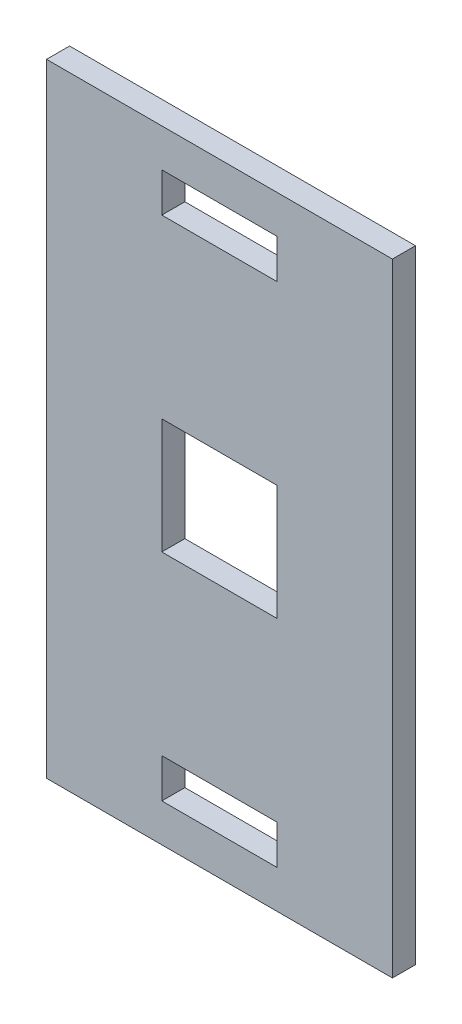
ISO-10303-21;
HEADER;
FILE_DESCRIPTION(('STEP AP214'),'2;1');
FILE_NAME('part.step','',(''),(''),'','','');
FILE_SCHEMA(('AUTOMOTIVE_DESIGN { 1 0 10303 214 1 1 1 1 }'));
ENDSEC;
DATA;
#1=APPLICATION_CONTEXT('core data for automotive mechanical design processes');
#2=APPLICATION_PROTOCOL_DEFINITION('international standard','automotive_design',2000,#1);
#3=PRODUCT_CONTEXT('',#1,'mechanical');
#4=PRODUCT('Part','Part','',(#3));
#5=PRODUCT_RELATED_PRODUCT_CATEGORY('part','',(#4));
#6=PRODUCT_DEFINITION_FORMATION('','',#4);
#7=PRODUCT_DEFINITION_CONTEXT('part definition',#1,'design');
#8=PRODUCT_DEFINITION('design','',#6,#7);
#9=PRODUCT_DEFINITION_SHAPE('','',#8);
#10=(LENGTH_UNIT() NAMED_UNIT(*) SI_UNIT(.MILLI.,.METRE.));
#11=(NAMED_UNIT(*) PLANE_ANGLE_UNIT() SI_UNIT($,.RADIAN.));
#12=(NAMED_UNIT(*) SI_UNIT($,.STERADIAN.) SOLID_ANGLE_UNIT());
#13=UNCERTAINTY_MEASURE_WITH_UNIT(LENGTH_MEASURE(1.E-05),#10,'distance_accuracy_value','');
#14=(GEOMETRIC_REPRESENTATION_CONTEXT(3) GLOBAL_UNCERTAINTY_ASSIGNED_CONTEXT((#13)) GLOBAL_UNIT_ASSIGNED_CONTEXT((#10,
#11,#12)) REPRESENTATION_CONTEXT('',''));
#15=CARTESIAN_POINT('',(0.,0.,0.));
#16=DIRECTION('',(0.,0.,1.));
#17=DIRECTION('',(1.,0.,0.));
#18=AXIS2_PLACEMENT_3D('',#15,#16,#17);
#19=CARTESIAN_POINT('',(0.,0.,2.));
#20=DIRECTION('',(0.,0.,-1.));
#21=DIRECTION('',(-1.,0.,0.));
#22=AXIS2_PLACEMENT_3D('',#19,#20,#21);
#23=PLANE('',#22);
#24=DIRECTION('',(0.,-1.,0.));
#25=VECTOR('',#24,1.);
#26=CARTESIAN_POINT('',(-5.,0.,2.));
#27=LINE('',#26,#25);
#28=CARTESIAN_POINT('',(-5.,-20.3,2.));
#29=VERTEX_POINT('',#28);
#30=CARTESIAN_POINT('',(-5.,-23.7,2.));
#31=VERTEX_POINT('',#30);
#32=EDGE_CURVE('E188',#29,#31,#27,.T.);
#33=ORIENTED_EDGE('',*,*,#32,.F.);
#34=DIRECTION('',(-1.,0.,0.));
#35=VECTOR('',#34,1.);
#36=CARTESIAN_POINT('',(0.,-20.3,2.));
#37=LINE('',#36,#35);
#38=CARTESIAN_POINT('',(5.,-20.3,2.));
#39=VERTEX_POINT('',#38);
#40=EDGE_CURVE('E181',#39,#29,#37,.T.);
#41=ORIENTED_EDGE('',*,*,#40,.F.);
#42=DIRECTION('',(0.,1.,0.));
#43=VECTOR('',#42,1.);
#44=CARTESIAN_POINT('',(5.,0.,2.));
#45=LINE('',#44,#43);
#46=CARTESIAN_POINT('',(5.,-23.7,2.));
#47=VERTEX_POINT('',#46);
#48=EDGE_CURVE('E183',#47,#39,#45,.T.);
#49=ORIENTED_EDGE('',*,*,#48,.F.);
#50=DIRECTION('',(1.,0.,0.));
#51=VECTOR('',#50,1.);
#52=CARTESIAN_POINT('',(0.,-23.7,2.));
#53=LINE('',#52,#51);
#54=EDGE_CURVE('E186',#31,#47,#53,.T.);
#55=ORIENTED_EDGE('',*,*,#54,.F.);
#56=EDGE_LOOP('',(#33,#41,#49,#55));
#57=FACE_BOUND('',#56,.T.);
#58=DIRECTION('',(0.,-1.,0.));
#59=VECTOR('',#58,1.);
#60=CARTESIAN_POINT('',(-15.,-27.,2.));
#61=LINE('',#60,#59);
#62=CARTESIAN_POINT('',(-15.,27.,2.));
#63=VERTEX_POINT('',#62);
#64=CARTESIAN_POINT('',(-15.,-27.,2.));
#65=VERTEX_POINT('',#64);
#66=EDGE_CURVE('E211',#63,#65,#61,.T.);
#67=ORIENTED_EDGE('',*,*,#66,.T.);
#68=DIRECTION('',(1.,0.,0.));
#69=VECTOR('',#68,1.);
#70=CARTESIAN_POINT('',(-15.,-27.,2.));
#71=LINE('',#70,#69);
#72=CARTESIAN_POINT('',(15.,-27.,2.));
#73=VERTEX_POINT('',#72);
#74=EDGE_CURVE('E214',#65,#73,#71,.T.);
#75=ORIENTED_EDGE('',*,*,#74,.T.);
#76=DIRECTION('',(0.,1.,0.));
#77=VECTOR('',#76,1.);
#78=CARTESIAN_POINT('',(15.,-27.,2.));
#79=LINE('',#78,#77);
#80=CARTESIAN_POINT('',(15.,27.,2.));
#81=VERTEX_POINT('',#80);
#82=EDGE_CURVE('E217',#73,#81,#79,.T.);
#83=ORIENTED_EDGE('',*,*,#82,.T.);
#84=DIRECTION('',(-1.,0.,0.));
#85=VECTOR('',#84,1.);
#86=CARTESIAN_POINT('',(-15.,27.,2.));
#87=LINE('',#86,#85);
#88=EDGE_CURVE('E219',#81,#63,#87,.T.);
#89=ORIENTED_EDGE('',*,*,#88,.T.);
#90=EDGE_LOOP('',(#67,#75,#83,#89));
#91=FACE_BOUND('',#90,.T.);
#92=DIRECTION('',(0.,-1.,0.));
#93=VECTOR('',#92,1.);
#94=CARTESIAN_POINT('',(-5.,0.,2.));
#95=LINE('',#94,#93);
#96=CARTESIAN_POINT('',(-5.,5.,2.));
#97=VERTEX_POINT('',#96);
#98=CARTESIAN_POINT('',(-5.,-5.,2.));
#99=VERTEX_POINT('',#98);
#100=EDGE_CURVE('E208',#97,#99,#95,.T.);
#101=ORIENTED_EDGE('',*,*,#100,.F.);
#102=DIRECTION('',(-1.,0.,0.));
#103=VECTOR('',#102,1.);
#104=CARTESIAN_POINT('',(0.,5.,2.));
#105=LINE('',#104,#103);
#106=CARTESIAN_POINT('',(5.,5.,2.));
#107=VERTEX_POINT('',#106);
#108=EDGE_CURVE('E201',#107,#97,#105,.T.);
#109=ORIENTED_EDGE('',*,*,#108,.F.);
#110=DIRECTION('',(0.,1.,0.));
#111=VECTOR('',#110,1.);
#112=CARTESIAN_POINT('',(5.,0.,2.));
#113=LINE('',#112,#111);
#114=CARTESIAN_POINT('',(5.,-5.,2.));
#115=VERTEX_POINT('',#114);
#116=EDGE_CURVE('E203',#115,#107,#113,.T.);
#117=ORIENTED_EDGE('',*,*,#116,.F.);
#118=DIRECTION('',(1.,0.,0.));
#119=VECTOR('',#118,1.);
#120=CARTESIAN_POINT('',(0.,-5.,2.));
#121=LINE('',#120,#119);
#122=EDGE_CURVE('E206',#99,#115,#121,.T.);
#123=ORIENTED_EDGE('',*,*,#122,.F.);
#124=EDGE_LOOP('',(#101,#109,#117,#123));
#125=FACE_BOUND('',#124,.T.);
#126=DIRECTION('',(0.,-1.,0.));
#127=VECTOR('',#126,1.);
#128=CARTESIAN_POINT('',(-5.,0.,2.));
#129=LINE('',#128,#127);
#130=CARTESIAN_POINT('',(-5.,23.7,2.));
#131=VERTEX_POINT('',#130);
#132=CARTESIAN_POINT('',(-5.,20.3,2.));
#133=VERTEX_POINT('',#132);
#134=EDGE_CURVE('E160',#131,#133,#129,.T.);
#135=ORIENTED_EDGE('',*,*,#134,.F.);
#136=DIRECTION('',(-1.,0.,0.));
#137=VECTOR('',#136,1.);
#138=CARTESIAN_POINT('',(0.,23.7,2.));
#139=LINE('',#138,#137);
#140=CARTESIAN_POINT('',(5.,23.7,2.));
#141=VERTEX_POINT('',#140);
#142=EDGE_CURVE('E149',#141,#131,#139,.T.);
#143=ORIENTED_EDGE('',*,*,#142,.F.);
#144=DIRECTION('',(0.,1.,0.));
#145=VECTOR('',#144,1.);
#146=CARTESIAN_POINT('',(5.,0.,2.));
#147=LINE('',#146,#145);
#148=CARTESIAN_POINT('',(5.,20.3,2.));
#149=VERTEX_POINT('',#148);
#150=EDGE_CURVE('E154',#149,#141,#147,.T.);
#151=ORIENTED_EDGE('',*,*,#150,.F.);
#152=DIRECTION('',(1.,0.,0.));
#153=VECTOR('',#152,1.);
#154=CARTESIAN_POINT('',(0.,20.3,2.));
#155=LINE('',#154,#153);
#156=EDGE_CURVE('E165',#133,#149,#155,.T.);
#157=ORIENTED_EDGE('',*,*,#156,.F.);
#158=EDGE_LOOP('',(#135,#143,#151,#157));
#159=FACE_BOUND('',#158,.T.);
#160=ADVANCED_FACE('F39',(#57,#91,#125,#159),#23,.F.);
#161=CARTESIAN_POINT('',(0.,0.,0.));
#162=DIRECTION('',(0.,0.,-1.));
#163=DIRECTION('',(-1.,0.,0.));
#164=AXIS2_PLACEMENT_3D('',#161,#162,#163);
#165=PLANE('',#164);
#166=DIRECTION('',(0.,-1.,0.));
#167=VECTOR('',#166,1.);
#168=CARTESIAN_POINT('',(-15.,-27.,0.));
#169=LINE('',#168,#167);
#170=CARTESIAN_POINT('',(-15.,27.,0.));
#171=VERTEX_POINT('',#170);
#172=CARTESIAN_POINT('',(-15.,-27.,0.));
#173=VERTEX_POINT('',#172);
#174=EDGE_CURVE('E210',#171,#173,#169,.T.);
#175=ORIENTED_EDGE('',*,*,#174,.F.);
#176=DIRECTION('',(-1.,0.,0.));
#177=VECTOR('',#176,1.);
#178=CARTESIAN_POINT('',(-15.,27.,0.));
#179=LINE('',#178,#177);
#180=CARTESIAN_POINT('',(15.,27.,0.));
#181=VERTEX_POINT('',#180);
#182=EDGE_CURVE('E215',#181,#171,#179,.T.);
#183=ORIENTED_EDGE('',*,*,#182,.F.);
#184=DIRECTION('',(0.,1.,0.));
#185=VECTOR('',#184,1.);
#186=CARTESIAN_POINT('',(15.,-27.,0.));
#187=LINE('',#186,#185);
#188=CARTESIAN_POINT('',(15.,-27.,0.));
#189=VERTEX_POINT('',#188);
#190=EDGE_CURVE('E226',#189,#181,#187,.T.);
#191=ORIENTED_EDGE('',*,*,#190,.F.);
#192=DIRECTION('',(1.,0.,0.));
#193=VECTOR('',#192,1.);
#194=CARTESIAN_POINT('',(-15.,-27.,0.));
#195=LINE('',#194,#193);
#196=EDGE_CURVE('E224',#173,#189,#195,.T.);
#197=ORIENTED_EDGE('',*,*,#196,.F.);
#198=EDGE_LOOP('',(#175,#183,#191,#197));
#199=FACE_BOUND('',#198,.T.);
#200=DIRECTION('',(-1.,0.,0.));
#201=VECTOR('',#200,1.);
#202=CARTESIAN_POINT('',(0.,5.,0.));
#203=LINE('',#202,#201);
#204=CARTESIAN_POINT('',(5.,5.,0.));
#205=VERTEX_POINT('',#204);
#206=CARTESIAN_POINT('',(-5.,5.,0.));
#207=VERTEX_POINT('',#206);
#208=EDGE_CURVE('E240',#205,#207,#203,.T.);
#209=ORIENTED_EDGE('',*,*,#208,.T.);
#210=DIRECTION('',(0.,-1.,0.));
#211=VECTOR('',#210,1.);
#212=CARTESIAN_POINT('',(-5.,0.,0.));
#213=LINE('',#212,#211);
#214=CARTESIAN_POINT('',(-5.,-5.,0.));
#215=VERTEX_POINT('',#214);
#216=EDGE_CURVE('E249',#207,#215,#213,.T.);
#217=ORIENTED_EDGE('',*,*,#216,.T.);
#218=DIRECTION('',(1.,0.,0.));
#219=VECTOR('',#218,1.);
#220=CARTESIAN_POINT('',(0.,-5.,0.));
#221=LINE('',#220,#219);
#222=CARTESIAN_POINT('',(5.,-5.,0.));
#223=VERTEX_POINT('',#222);
#224=EDGE_CURVE('E246',#215,#223,#221,.T.);
#225=ORIENTED_EDGE('',*,*,#224,.T.);
#226=DIRECTION('',(0.,1.,0.));
#227=VECTOR('',#226,1.);
#228=CARTESIAN_POINT('',(5.,0.,0.));
#229=LINE('',#228,#227);
#230=EDGE_CURVE('E243',#223,#205,#229,.T.);
#231=ORIENTED_EDGE('',*,*,#230,.T.);
#232=EDGE_LOOP('',(#209,#217,#225,#231));
#233=FACE_BOUND('',#232,.T.);
#234=DIRECTION('',(-1.,0.,0.));
#235=VECTOR('',#234,1.);
#236=CARTESIAN_POINT('',(0.,-20.3,0.));
#237=LINE('',#236,#235);
#238=CARTESIAN_POINT('',(5.,-20.3,0.));
#239=VERTEX_POINT('',#238);
#240=CARTESIAN_POINT('',(-5.,-20.3,0.));
#241=VERTEX_POINT('',#240);
#242=EDGE_CURVE('E252',#239,#241,#237,.T.);
#243=ORIENTED_EDGE('',*,*,#242,.T.);
#244=DIRECTION('',(0.,-1.,0.));
#245=VECTOR('',#244,1.);
#246=CARTESIAN_POINT('',(-5.,0.,0.));
#247=LINE('',#246,#245);
#248=CARTESIAN_POINT('',(-5.,-23.7,0.));
#249=VERTEX_POINT('',#248);
#250=EDGE_CURVE('E261',#241,#249,#247,.T.);
#251=ORIENTED_EDGE('',*,*,#250,.T.);
#252=DIRECTION('',(1.,0.,0.));
#253=VECTOR('',#252,1.);
#254=CARTESIAN_POINT('',(0.,-23.7,0.));
#255=LINE('',#254,#253);
#256=CARTESIAN_POINT('',(5.,-23.7,0.));
#257=VERTEX_POINT('',#256);
#258=EDGE_CURVE('E258',#249,#257,#255,.T.);
#259=ORIENTED_EDGE('',*,*,#258,.T.);
#260=DIRECTION('',(0.,1.,0.));
#261=VECTOR('',#260,1.);
#262=CARTESIAN_POINT('',(5.,0.,0.));
#263=LINE('',#262,#261);
#264=EDGE_CURVE('E255',#257,#239,#263,.T.);
#265=ORIENTED_EDGE('',*,*,#264,.T.);
#266=EDGE_LOOP('',(#243,#251,#259,#265));
#267=FACE_BOUND('',#266,.T.);
#268=DIRECTION('',(-1.,0.,0.));
#269=VECTOR('',#268,1.);
#270=CARTESIAN_POINT('',(0.,23.7,0.));
#271=LINE('',#270,#269);
#272=CARTESIAN_POINT('',(5.,23.7,0.));
#273=VERTEX_POINT('',#272);
#274=CARTESIAN_POINT('',(-5.,23.7,0.));
#275=VERTEX_POINT('',#274);
#276=EDGE_CURVE('E264',#273,#275,#271,.T.);
#277=ORIENTED_EDGE('',*,*,#276,.T.);
#278=DIRECTION('',(0.,-1.,0.));
#279=VECTOR('',#278,1.);
#280=CARTESIAN_POINT('',(-5.,0.,0.));
#281=LINE('',#280,#279);
#282=CARTESIAN_POINT('',(-5.,20.3,0.));
#283=VERTEX_POINT('',#282);
#284=EDGE_CURVE('E11',#275,#283,#281,.T.);
#285=ORIENTED_EDGE('',*,*,#284,.T.);
#286=DIRECTION('',(1.,0.,0.));
#287=VECTOR('',#286,1.);
#288=CARTESIAN_POINT('',(0.,20.3,0.));
#289=LINE('',#288,#287);
#290=CARTESIAN_POINT('',(5.,20.3,0.));
#291=VERTEX_POINT('',#290);
#292=EDGE_CURVE('E47',#283,#291,#289,.T.);
#293=ORIENTED_EDGE('',*,*,#292,.T.);
#294=DIRECTION('',(0.,1.,0.));
#295=VECTOR('',#294,1.);
#296=CARTESIAN_POINT('',(5.,0.,0.));
#297=LINE('',#296,#295);
#298=EDGE_CURVE('E266',#291,#273,#297,.T.);
#299=ORIENTED_EDGE('',*,*,#298,.T.);
#300=EDGE_LOOP('',(#277,#285,#293,#299));
#301=FACE_BOUND('',#300,.T.);
#302=ADVANCED_FACE('F270',(#199,#233,#267,#301),#165,.T.);
#303=CARTESIAN_POINT('',(-15.,-27.,2.));
#304=DIRECTION('',(1.,0.,0.));
#305=DIRECTION('',(0.,0.,-1.));
#306=AXIS2_PLACEMENT_3D('',#303,#304,#305);
#307=PLANE('',#306);
#308=ORIENTED_EDGE('',*,*,#174,.T.);
#309=DIRECTION('',(0.,0.,-1.));
#310=VECTOR('',#309,1.);
#311=CARTESIAN_POINT('',(-15.,-27.,2.));
#312=LINE('',#311,#310);
#313=EDGE_CURVE('E237',#65,#173,#312,.T.);
#314=ORIENTED_EDGE('',*,*,#313,.F.);
#315=ORIENTED_EDGE('',*,*,#66,.F.);
#316=DIRECTION('',(0.,0.,-1.));
#317=VECTOR('',#316,1.);
#318=CARTESIAN_POINT('',(-15.,27.,2.));
#319=LINE('',#318,#317);
#320=EDGE_CURVE('E221',#63,#171,#319,.T.);
#321=ORIENTED_EDGE('',*,*,#320,.T.);
#322=EDGE_LOOP('',(#308,#314,#315,#321));
#323=FACE_BOUND('',#322,.T.);
#324=ADVANCED_FACE('F41',(#323),#307,.F.);
#325=CARTESIAN_POINT('',(-15.,-27.,2.));
#326=DIRECTION('',(0.,1.,0.));
#327=DIRECTION('',(0.,0.,1.));
#328=AXIS2_PLACEMENT_3D('',#325,#326,#327);
#329=PLANE('',#328);
#330=ORIENTED_EDGE('',*,*,#196,.T.);
#331=DIRECTION('',(0.,0.,-1.));
#332=VECTOR('',#331,1.);
#333=CARTESIAN_POINT('',(15.,-27.,2.));
#334=LINE('',#333,#332);
#335=EDGE_CURVE('E234',#73,#189,#334,.T.);
#336=ORIENTED_EDGE('',*,*,#335,.F.);
#337=ORIENTED_EDGE('',*,*,#74,.F.);
#338=ORIENTED_EDGE('',*,*,#313,.T.);
#339=EDGE_LOOP('',(#330,#336,#337,#338));
#340=FACE_BOUND('',#339,.T.);
#341=ADVANCED_FACE('F310',(#340),#329,.F.);
#342=CARTESIAN_POINT('',(15.,-27.,2.));
#343=DIRECTION('',(-1.,0.,0.));
#344=DIRECTION('',(0.,0.,1.));
#345=AXIS2_PLACEMENT_3D('',#342,#343,#344);
#346=PLANE('',#345);
#347=ORIENTED_EDGE('',*,*,#190,.T.);
#348=DIRECTION('',(0.,0.,-1.));
#349=VECTOR('',#348,1.);
#350=CARTESIAN_POINT('',(15.,27.,2.));
#351=LINE('',#350,#349);
#352=EDGE_CURVE('E231',#81,#181,#351,.T.);
#353=ORIENTED_EDGE('',*,*,#352,.F.);
#354=ORIENTED_EDGE('',*,*,#82,.F.);
#355=ORIENTED_EDGE('',*,*,#335,.T.);
#356=EDGE_LOOP('',(#347,#353,#354,#355));
#357=FACE_BOUND('',#356,.T.);
#358=ADVANCED_FACE('F307',(#357),#346,.F.);
#359=CARTESIAN_POINT('',(-15.,27.,2.));
#360=DIRECTION('',(0.,-1.,0.));
#361=DIRECTION('',(0.,0.,-1.));
#362=AXIS2_PLACEMENT_3D('',#359,#360,#361);
#363=PLANE('',#362);
#364=ORIENTED_EDGE('',*,*,#182,.T.);
#365=ORIENTED_EDGE('',*,*,#320,.F.);
#366=ORIENTED_EDGE('',*,*,#88,.F.);
#367=ORIENTED_EDGE('',*,*,#352,.T.);
#368=EDGE_LOOP('',(#364,#365,#366,#367));
#369=FACE_BOUND('',#368,.T.);
#370=ADVANCED_FACE('F304',(#369),#363,.F.);
#371=CARTESIAN_POINT('',(-5.,-5.,2.1));
#372=DIRECTION('',(1.,0.,0.));
#373=DIRECTION('',(0.,0.,-1.));
#374=AXIS2_PLACEMENT_3D('',#371,#372,#373);
#375=PLANE('',#374);
#376=ORIENTED_EDGE('',*,*,#100,.T.);
#377=DIRECTION('',(0.,0.,-1.));
#378=VECTOR('',#377,1.);
#379=CARTESIAN_POINT('',(-5.,-5.,2.1));
#380=LINE('',#379,#378);
#381=EDGE_CURVE('E198',#99,#215,#380,.T.);
#382=ORIENTED_EDGE('',*,*,#381,.T.);
#383=ORIENTED_EDGE('',*,*,#216,.F.);
#384=DIRECTION('',(0.,0.,-1.));
#385=VECTOR('',#384,1.);
#386=CARTESIAN_POINT('',(-5.,5.,2.1));
#387=LINE('',#386,#385);
#388=EDGE_CURVE('E190',#97,#207,#387,.T.);
#389=ORIENTED_EDGE('',*,*,#388,.F.);
#390=EDGE_LOOP('',(#376,#382,#383,#389));
#391=FACE_BOUND('',#390,.T.);
#392=ADVANCED_FACE('F301',(#391),#375,.T.);
#393=CARTESIAN_POINT('',(-5.,-5.,2.1));
#394=DIRECTION('',(0.,1.,0.));
#395=DIRECTION('',(0.,0.,1.));
#396=AXIS2_PLACEMENT_3D('',#393,#394,#395);
#397=PLANE('',#396);
#398=ORIENTED_EDGE('',*,*,#122,.T.);
#399=DIRECTION('',(0.,0.,-1.));
#400=VECTOR('',#399,1.);
#401=CARTESIAN_POINT('',(5.,-5.,2.1));
#402=LINE('',#401,#400);
#403=EDGE_CURVE('E195',#115,#223,#402,.T.);
#404=ORIENTED_EDGE('',*,*,#403,.T.);
#405=ORIENTED_EDGE('',*,*,#224,.F.);
#406=ORIENTED_EDGE('',*,*,#381,.F.);
#407=EDGE_LOOP('',(#398,#404,#405,#406));
#408=FACE_BOUND('',#407,.T.);
#409=ADVANCED_FACE('F339',(#408),#397,.T.);
#410=CARTESIAN_POINT('',(5.,-5.,2.1));
#411=DIRECTION('',(-1.,0.,0.));
#412=DIRECTION('',(0.,0.,1.));
#413=AXIS2_PLACEMENT_3D('',#410,#411,#412);
#414=PLANE('',#413);
#415=ORIENTED_EDGE('',*,*,#116,.T.);
#416=DIRECTION('',(0.,0.,-1.));
#417=VECTOR('',#416,1.);
#418=CARTESIAN_POINT('',(5.,5.,2.1));
#419=LINE('',#418,#417);
#420=EDGE_CURVE('E192',#107,#205,#419,.T.);
#421=ORIENTED_EDGE('',*,*,#420,.T.);
#422=ORIENTED_EDGE('',*,*,#230,.F.);
#423=ORIENTED_EDGE('',*,*,#403,.F.);
#424=EDGE_LOOP('',(#415,#421,#422,#423));
#425=FACE_BOUND('',#424,.T.);
#426=ADVANCED_FACE('F345',(#425),#414,.T.);
#427=CARTESIAN_POINT('',(-5.,5.,2.1));
#428=DIRECTION('',(0.,-1.,0.));
#429=DIRECTION('',(0.,0.,-1.));
#430=AXIS2_PLACEMENT_3D('',#427,#428,#429);
#431=PLANE('',#430);
#432=ORIENTED_EDGE('',*,*,#108,.T.);
#433=ORIENTED_EDGE('',*,*,#388,.T.);
#434=ORIENTED_EDGE('',*,*,#208,.F.);
#435=ORIENTED_EDGE('',*,*,#420,.F.);
#436=EDGE_LOOP('',(#432,#433,#434,#435));
#437=FACE_BOUND('',#436,.T.);
#438=ADVANCED_FACE('F343',(#437),#431,.T.);
#439=CARTESIAN_POINT('',(-5.,-23.7,2.1));
#440=DIRECTION('',(1.,0.,0.));
#441=DIRECTION('',(0.,0.,-1.));
#442=AXIS2_PLACEMENT_3D('',#439,#440,#441);
#443=PLANE('',#442);
#444=ORIENTED_EDGE('',*,*,#32,.T.);
#445=DIRECTION('',(0.,0.,-1.));
#446=VECTOR('',#445,1.);
#447=CARTESIAN_POINT('',(-5.,-23.7,2.1));
#448=LINE('',#447,#446);
#449=EDGE_CURVE('E178',#31,#249,#448,.T.);
#450=ORIENTED_EDGE('',*,*,#449,.T.);
#451=ORIENTED_EDGE('',*,*,#250,.F.);
#452=DIRECTION('',(0.,0.,-1.));
#453=VECTOR('',#452,1.);
#454=CARTESIAN_POINT('',(-5.,-20.3,2.1));
#455=LINE('',#454,#453);
#456=EDGE_CURVE('E166',#29,#241,#455,.T.);
#457=ORIENTED_EDGE('',*,*,#456,.F.);
#458=EDGE_LOOP('',(#444,#450,#451,#457));
#459=FACE_BOUND('',#458,.T.);
#460=ADVANCED_FACE('F352',(#459),#443,.T.);
#461=CARTESIAN_POINT('',(-5.,-23.7,2.1));
#462=DIRECTION('',(0.,1.,0.));
#463=DIRECTION('',(0.,0.,1.));
#464=AXIS2_PLACEMENT_3D('',#461,#462,#463);
#465=PLANE('',#464);
#466=ORIENTED_EDGE('',*,*,#54,.T.);
#467=DIRECTION('',(0.,0.,-1.));
#468=VECTOR('',#467,1.);
#469=CARTESIAN_POINT('',(5.,-23.7,2.1));
#470=LINE('',#469,#468);
#471=EDGE_CURVE('E175',#47,#257,#470,.T.);
#472=ORIENTED_EDGE('',*,*,#471,.T.);
#473=ORIENTED_EDGE('',*,*,#258,.F.);
#474=ORIENTED_EDGE('',*,*,#449,.F.);
#475=EDGE_LOOP('',(#466,#472,#473,#474));
#476=FACE_BOUND('',#475,.T.);
#477=ADVANCED_FACE('F357',(#476),#465,.T.);
#478=CARTESIAN_POINT('',(5.,-23.7,2.1));
#479=DIRECTION('',(-1.,0.,0.));
#480=DIRECTION('',(0.,0.,1.));
#481=AXIS2_PLACEMENT_3D('',#478,#479,#480);
#482=PLANE('',#481);
#483=ORIENTED_EDGE('',*,*,#48,.T.);
#484=DIRECTION('',(0.,0.,-1.));
#485=VECTOR('',#484,1.);
#486=CARTESIAN_POINT('',(5.,-20.3,2.1));
#487=LINE('',#486,#485);
#488=EDGE_CURVE('E168',#39,#239,#487,.T.);
#489=ORIENTED_EDGE('',*,*,#488,.T.);
#490=ORIENTED_EDGE('',*,*,#264,.F.);
#491=ORIENTED_EDGE('',*,*,#471,.F.);
#492=EDGE_LOOP('',(#483,#489,#490,#491));
#493=FACE_BOUND('',#492,.T.);
#494=ADVANCED_FACE('F361',(#493),#482,.T.);
#495=CARTESIAN_POINT('',(-5.,-20.3,2.1));
#496=DIRECTION('',(0.,-1.,0.));
#497=DIRECTION('',(0.,0.,-1.));
#498=AXIS2_PLACEMENT_3D('',#495,#496,#497);
#499=PLANE('',#498);
#500=ORIENTED_EDGE('',*,*,#40,.T.);
#501=ORIENTED_EDGE('',*,*,#456,.T.);
#502=ORIENTED_EDGE('',*,*,#242,.F.);
#503=ORIENTED_EDGE('',*,*,#488,.F.);
#504=EDGE_LOOP('',(#500,#501,#502,#503));
#505=FACE_BOUND('',#504,.T.);
#506=ADVANCED_FACE('F365',(#505),#499,.T.);
#507=CARTESIAN_POINT('',(-5.,20.3,2.1));
#508=DIRECTION('',(1.,0.,0.));
#509=DIRECTION('',(0.,0.,-1.));
#510=AXIS2_PLACEMENT_3D('',#507,#508,#509);
#511=PLANE('',#510);
#512=ORIENTED_EDGE('',*,*,#134,.T.);
#513=DIRECTION('',(0.,0.,-1.));
#514=VECTOR('',#513,1.);
#515=CARTESIAN_POINT('',(-5.,20.3,2.1));
#516=LINE('',#515,#514);
#517=EDGE_CURVE('E155',#133,#283,#516,.T.);
#518=ORIENTED_EDGE('',*,*,#517,.T.);
#519=ORIENTED_EDGE('',*,*,#284,.F.);
#520=DIRECTION('',(0.,0.,-1.));
#521=VECTOR('',#520,1.);
#522=CARTESIAN_POINT('',(-5.,23.7,2.1));
#523=LINE('',#522,#521);
#524=EDGE_CURVE('E59',#131,#275,#523,.T.);
#525=ORIENTED_EDGE('',*,*,#524,.F.);
#526=EDGE_LOOP('',(#512,#518,#519,#525));
#527=FACE_BOUND('',#526,.T.);
#528=ADVANCED_FACE('F158',(#527),#511,.T.);
#529=CARTESIAN_POINT('',(-5.,20.3,2.1));
#530=DIRECTION('',(0.,1.,0.));
#531=DIRECTION('',(0.,0.,1.));
#532=AXIS2_PLACEMENT_3D('',#529,#530,#531);
#533=PLANE('',#532);
#534=ORIENTED_EDGE('',*,*,#156,.T.);
#535=DIRECTION('',(0.,0.,-1.));
#536=VECTOR('',#535,1.);
#537=CARTESIAN_POINT('',(5.,20.3,2.1));
#538=LINE('',#537,#536);
#539=EDGE_CURVE('E275',#149,#291,#538,.T.);
#540=ORIENTED_EDGE('',*,*,#539,.T.);
#541=ORIENTED_EDGE('',*,*,#292,.F.);
#542=ORIENTED_EDGE('',*,*,#517,.F.);
#543=EDGE_LOOP('',(#534,#540,#541,#542));
#544=FACE_BOUND('',#543,.T.);
#545=ADVANCED_FACE('F273',(#544),#533,.T.);
#546=CARTESIAN_POINT('',(5.,20.3,2.1));
#547=DIRECTION('',(-1.,0.,0.));
#548=DIRECTION('',(0.,0.,1.));
#549=AXIS2_PLACEMENT_3D('',#546,#547,#548);
#550=PLANE('',#549);
#551=ORIENTED_EDGE('',*,*,#150,.T.);
#552=DIRECTION('',(0.,0.,-1.));
#553=VECTOR('',#552,1.);
#554=CARTESIAN_POINT('',(5.,23.7,2.1));
#555=LINE('',#554,#553);
#556=EDGE_CURVE('E54',#141,#273,#555,.T.);
#557=ORIENTED_EDGE('',*,*,#556,.T.);
#558=ORIENTED_EDGE('',*,*,#298,.F.);
#559=ORIENTED_EDGE('',*,*,#539,.F.);
#560=EDGE_LOOP('',(#551,#557,#558,#559));
#561=FACE_BOUND('',#560,.T.);
#562=ADVANCED_FACE('F280',(#561),#550,.T.);
#563=CARTESIAN_POINT('',(-5.,23.7,2.1));
#564=DIRECTION('',(0.,-1.,0.));
#565=DIRECTION('',(0.,0.,-1.));
#566=AXIS2_PLACEMENT_3D('',#563,#564,#565);
#567=PLANE('',#566);
#568=ORIENTED_EDGE('',*,*,#142,.T.);
#569=ORIENTED_EDGE('',*,*,#524,.T.);
#570=ORIENTED_EDGE('',*,*,#276,.F.);
#571=ORIENTED_EDGE('',*,*,#556,.F.);
#572=EDGE_LOOP('',(#568,#569,#570,#571));
#573=FACE_BOUND('',#572,.T.);
#574=ADVANCED_FACE('F150',(#573),#567,.T.);
#575=CLOSED_SHELL('',(#160,#302,#324,#341,#358,#370,#392,#409,#426,#438,#460,#477,#494,#506,
#528,#545,#562,#574));
#576=MANIFOLD_SOLID_BREP('B2',#575);
#577=ADVANCED_BREP_SHAPE_REPRESENTATION('',(#18,#576),#14);
#578=SHAPE_DEFINITION_REPRESENTATION(#9,#577);
ENDSEC;
END-ISO-10303-21;
